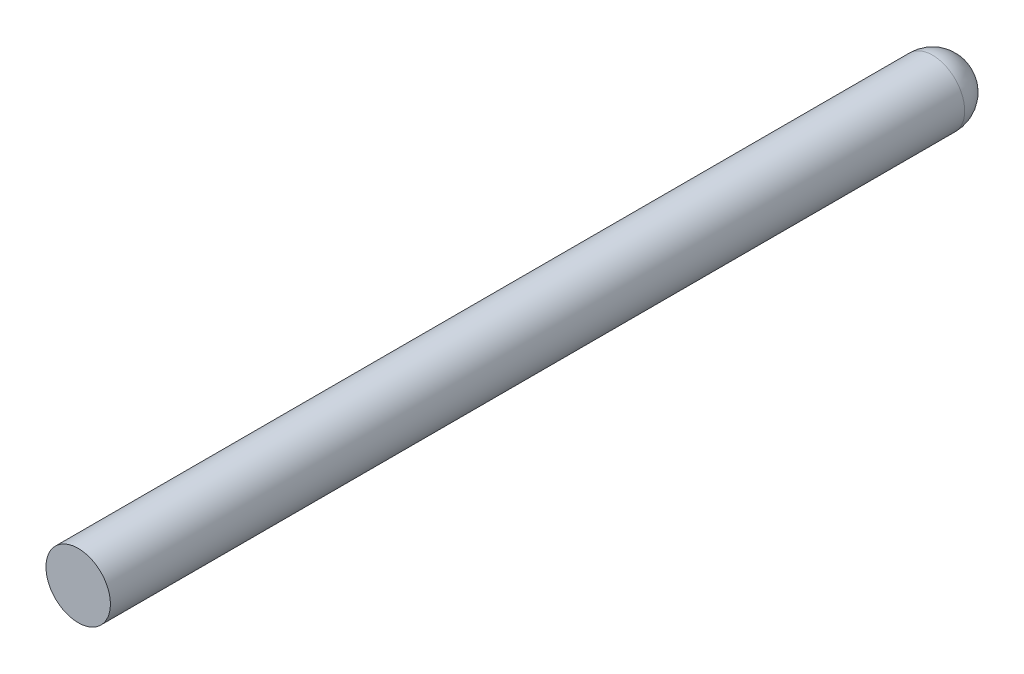
ISO-10303-21;
HEADER;
FILE_DESCRIPTION(('STEP AP214'),'2;1');
FILE_NAME('part.step','',(''),(''),'','','');
FILE_SCHEMA(('AUTOMOTIVE_DESIGN { 1 0 10303 214 1 1 1 1 }'));
ENDSEC;
DATA;
#1=APPLICATION_CONTEXT('core data for automotive mechanical design processes');
#2=APPLICATION_PROTOCOL_DEFINITION('international standard','automotive_design',2000,#1);
#3=PRODUCT_CONTEXT('',#1,'mechanical');
#4=PRODUCT('Part','Part','',(#3));
#5=PRODUCT_RELATED_PRODUCT_CATEGORY('part','',(#4));
#6=PRODUCT_DEFINITION_FORMATION('','',#4);
#7=PRODUCT_DEFINITION_CONTEXT('part definition',#1,'design');
#8=PRODUCT_DEFINITION('design','',#6,#7);
#9=PRODUCT_DEFINITION_SHAPE('','',#8);
#10=(LENGTH_UNIT() NAMED_UNIT(*) SI_UNIT(.MILLI.,.METRE.));
#11=(NAMED_UNIT(*) PLANE_ANGLE_UNIT() SI_UNIT($,.RADIAN.));
#12=(NAMED_UNIT(*) SI_UNIT($,.STERADIAN.) SOLID_ANGLE_UNIT());
#13=UNCERTAINTY_MEASURE_WITH_UNIT(LENGTH_MEASURE(1.E-05),#10,'distance_accuracy_value','');
#14=(GEOMETRIC_REPRESENTATION_CONTEXT(3) GLOBAL_UNCERTAINTY_ASSIGNED_CONTEXT((#13)) GLOBAL_UNIT_ASSIGNED_CONTEXT((#10,
#11,#12)) REPRESENTATION_CONTEXT('',''));
#15=CARTESIAN_POINT('',(0.,0.,0.));
#16=DIRECTION('',(0.,0.,1.));
#17=DIRECTION('',(1.,0.,0.));
#18=AXIS2_PLACEMENT_3D('',#15,#16,#17);
#19=CARTESIAN_POINT('',(0.,0.,0.));
#20=DIRECTION('',(0.,0.,1.));
#21=DIRECTION('',(1.,0.,0.));
#22=AXIS2_PLACEMENT_3D('',#19,#20,#21);
#23=PLANE('',#22);
#24=CARTESIAN_POINT('',(0.,0.,0.));
#25=DIRECTION('',(0.,0.,1.));
#26=DIRECTION('',(1.,0.,0.));
#27=AXIS2_PLACEMENT_3D('',#24,#25,#26);
#28=CIRCLE('',#27,4.);
#29=CARTESIAN_POINT('',(4.,0.,0.));
#30=VERTEX_POINT('',#29);
#31=EDGE_CURVE('E10',#30,#30,#28,.T.);
#32=ORIENTED_EDGE('',*,*,#31,.T.);
#33=EDGE_LOOP('',(#32));
#34=FACE_BOUND('',#33,.T.);
#35=ADVANCED_FACE('F41',(#34),#23,.T.);
#36=CARTESIAN_POINT('',(4.89014323856641E-12,0.,1425.5942469934));
#37=DIRECTION('',(0.,0.,1.));
#38=DIRECTION('',(1.,0.,0.));
#39=AXIS2_PLACEMENT_3D('',#36,#37,#38);
#40=CYLINDRICAL_SURFACE('',#39,4.00000000000019);
#41=CARTESIAN_POINT('',(-3.63606393881891E-13,0.,-106.));
#42=DIRECTION('',(0.,0.,1.));
#43=DIRECTION('',(1.,0.,0.));
#44=AXIS2_PLACEMENT_3D('',#41,#42,#43);
#45=CIRCLE('',#44,4.00000000000039);
#46=CARTESIAN_POINT('',(4.00000000000002,0.,-106.));
#47=VERTEX_POINT('',#46);
#48=EDGE_CURVE('E48',#47,#47,#45,.T.);
#49=ORIENTED_EDGE('',*,*,#48,.T.);
#50=EDGE_LOOP('',(#49));
#51=FACE_BOUND('',#50,.T.);
#52=ORIENTED_EDGE('',*,*,#31,.F.);
#53=EDGE_LOOP('',(#52));
#54=FACE_BOUND('',#53,.T.);
#55=ADVANCED_FACE('F55',(#51,#54),#40,.T.);
#56=CARTESIAN_POINT('',(0.,0.,-106.));
#57=DIRECTION('',(0.,0.,1.));
#58=DIRECTION('',(1.,0.,0.));
#59=AXIS2_PLACEMENT_3D('',#56,#57,#58);
#60=SPHERICAL_SURFACE('',#59,4.00000000000002);
#61=ORIENTED_EDGE('',*,*,#48,.F.);
#62=EDGE_LOOP('',(#61));
#63=FACE_BOUND('',#62,.T.);
#64=ADVANCED_FACE('F58',(#63),#60,.T.);
#65=CLOSED_SHELL('',(#35,#55,#64));
#66=MANIFOLD_SOLID_BREP('B2',#65);
#67=ADVANCED_BREP_SHAPE_REPRESENTATION('',(#18,#66),#14);
#68=SHAPE_DEFINITION_REPRESENTATION(#9,#67);
ENDSEC;
END-ISO-10303-21;
